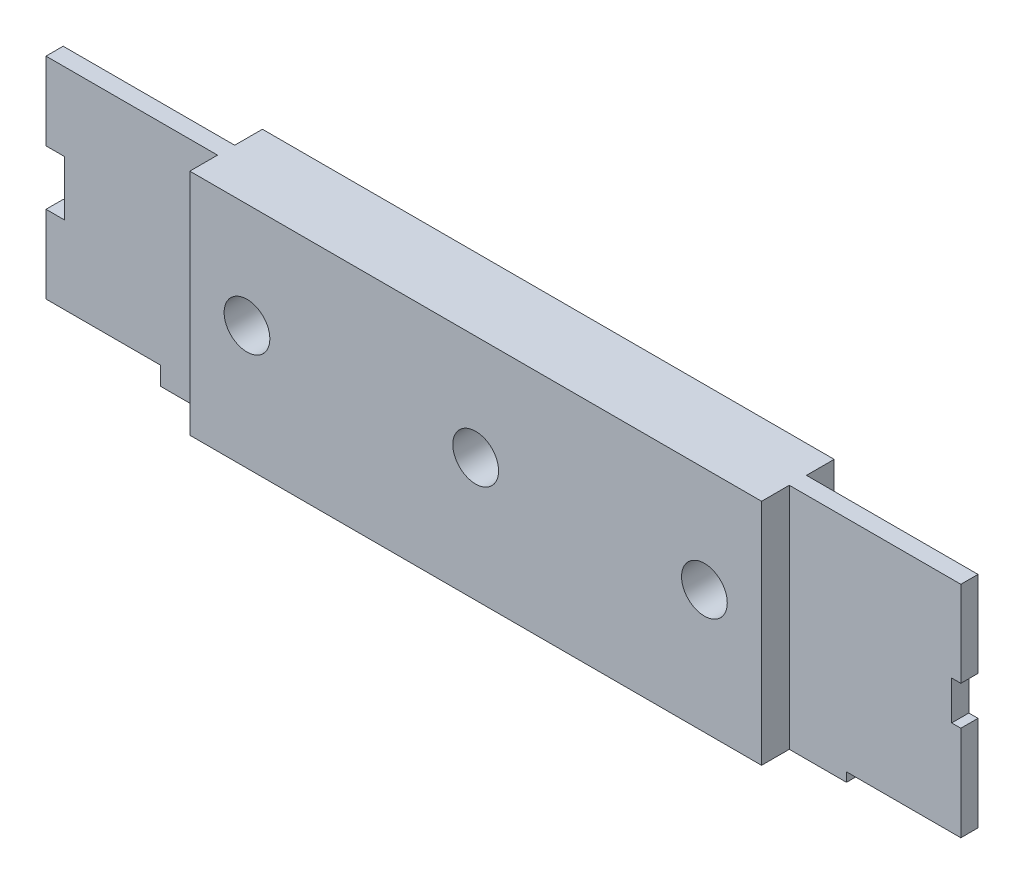
ISO-10303-21;
HEADER;
FILE_DESCRIPTION(('STEP AP214'),'2;1');
FILE_NAME('part.step','',(''),(''),'','','');
FILE_SCHEMA(('AUTOMOTIVE_DESIGN { 1 0 10303 214 1 1 1 1 }'));
ENDSEC;
DATA;
#1=APPLICATION_CONTEXT('core data for automotive mechanical design processes');
#2=APPLICATION_PROTOCOL_DEFINITION('international standard','automotive_design',2000,#1);
#3=PRODUCT_CONTEXT('',#1,'mechanical');
#4=PRODUCT('Part','Part','',(#3));
#5=PRODUCT_RELATED_PRODUCT_CATEGORY('part','',(#4));
#6=PRODUCT_DEFINITION_FORMATION('','',#4);
#7=PRODUCT_DEFINITION_CONTEXT('part definition',#1,'design');
#8=PRODUCT_DEFINITION('design','',#6,#7);
#9=PRODUCT_DEFINITION_SHAPE('','',#8);
#10=(LENGTH_UNIT() NAMED_UNIT(*) SI_UNIT(.MILLI.,.METRE.));
#11=(NAMED_UNIT(*) PLANE_ANGLE_UNIT() SI_UNIT($,.RADIAN.));
#12=(NAMED_UNIT(*) SI_UNIT($,.STERADIAN.) SOLID_ANGLE_UNIT());
#13=UNCERTAINTY_MEASURE_WITH_UNIT(LENGTH_MEASURE(1.E-05),#10,'distance_accuracy_value','');
#14=(GEOMETRIC_REPRESENTATION_CONTEXT(3) GLOBAL_UNCERTAINTY_ASSIGNED_CONTEXT((#13)) GLOBAL_UNIT_ASSIGNED_CONTEXT((#10,
#11,#12)) REPRESENTATION_CONTEXT('',''));
#15=CARTESIAN_POINT('',(0.,0.,0.));
#16=DIRECTION('',(0.,0.,1.));
#17=DIRECTION('',(1.,0.,0.));
#18=AXIS2_PLACEMENT_3D('',#15,#16,#17);
#19=CARTESIAN_POINT('',(0.,0.,0.75));
#20=DIRECTION('',(0.,0.,-1.));
#21=DIRECTION('',(-1.,0.,0.));
#22=AXIS2_PLACEMENT_3D('',#19,#20,#21);
#23=PLANE('',#22);
#24=DIRECTION('',(0.,-1.,0.));
#25=VECTOR('',#24,1.);
#26=CARTESIAN_POINT('',(-25.0000000000001,0.,0.75));
#27=LINE('',#26,#25);
#28=CARTESIAN_POINT('',(-25.0000000000001,9.19999999999999,0.75));
#29=VERTEX_POINT('',#28);
#30=CARTESIAN_POINT('',(-25.0000000000001,-10.8,0.75));
#31=VERTEX_POINT('',#30);
#32=EDGE_CURVE('E218',#29,#31,#27,.T.);
#33=ORIENTED_EDGE('',*,*,#32,.F.);
#34=DIRECTION('',(-1.,0.,0.));
#35=VECTOR('',#34,1.);
#36=CARTESIAN_POINT('',(-40.,9.19999999999997,0.75));
#37=LINE('',#36,#35);
#38=CARTESIAN_POINT('',(-40.,9.19999999999997,0.75));
#39=VERTEX_POINT('',#38);
#40=EDGE_CURVE('E265',#29,#39,#37,.T.);
#41=ORIENTED_EDGE('',*,*,#40,.T.);
#42=DIRECTION('',(0.,-1.,0.));
#43=VECTOR('',#42,1.);
#44=CARTESIAN_POINT('',(-40.,2.4,0.75));
#45=LINE('',#44,#43);
#46=CARTESIAN_POINT('',(-40.,2.4,0.75));
#47=VERTEX_POINT('',#46);
#48=EDGE_CURVE('E233',#39,#47,#45,.T.);
#49=ORIENTED_EDGE('',*,*,#48,.T.);
#50=DIRECTION('',(1.,0.,0.));
#51=VECTOR('',#50,1.);
#52=CARTESIAN_POINT('',(-38.4,2.4,0.75));
#53=LINE('',#52,#51);
#54=CARTESIAN_POINT('',(-38.4,2.4,0.75));
#55=VERTEX_POINT('',#54);
#56=EDGE_CURVE('E236',#47,#55,#53,.T.);
#57=ORIENTED_EDGE('',*,*,#56,.T.);
#58=DIRECTION('',(0.,-1.,0.));
#59=VECTOR('',#58,1.);
#60=CARTESIAN_POINT('',(-38.4,-2.4,0.75));
#61=LINE('',#60,#59);
#62=CARTESIAN_POINT('',(-38.4,-2.4,0.75));
#63=VERTEX_POINT('',#62);
#64=EDGE_CURVE('E239',#55,#63,#61,.T.);
#65=ORIENTED_EDGE('',*,*,#64,.T.);
#66=DIRECTION('',(-1.,0.,0.));
#67=VECTOR('',#66,1.);
#68=CARTESIAN_POINT('',(-40.,-2.4,0.75));
#69=LINE('',#68,#67);
#70=CARTESIAN_POINT('',(-40.,-2.4,0.75));
#71=VERTEX_POINT('',#70);
#72=EDGE_CURVE('E241',#63,#71,#69,.T.);
#73=ORIENTED_EDGE('',*,*,#72,.T.);
#74=DIRECTION('',(0.,-1.,0.));
#75=VECTOR('',#74,1.);
#76=CARTESIAN_POINT('',(-40.,-9.20000000000003,0.75));
#77=LINE('',#76,#75);
#78=CARTESIAN_POINT('',(-40.,-9.20000000000003,0.75));
#79=VERTEX_POINT('',#78);
#80=EDGE_CURVE('E243',#71,#79,#77,.T.);
#81=ORIENTED_EDGE('',*,*,#80,.T.);
#82=DIRECTION('',(1.,0.,0.));
#83=VECTOR('',#82,1.);
#84=CARTESIAN_POINT('',(-30.,-9.2,0.75));
#85=LINE('',#84,#83);
#86=CARTESIAN_POINT('',(-30.,-9.2,0.75));
#87=VERTEX_POINT('',#86);
#88=EDGE_CURVE('E245',#79,#87,#85,.T.);
#89=ORIENTED_EDGE('',*,*,#88,.T.);
#90=DIRECTION('',(0.,-1.,0.));
#91=VECTOR('',#90,1.);
#92=CARTESIAN_POINT('',(-30.,-10.8,0.75));
#93=LINE('',#92,#91);
#94=CARTESIAN_POINT('',(-30.,-10.8,0.75));
#95=VERTEX_POINT('',#94);
#96=EDGE_CURVE('E247',#87,#95,#93,.T.);
#97=ORIENTED_EDGE('',*,*,#96,.T.);
#98=DIRECTION('',(1.,0.,0.));
#99=VECTOR('',#98,1.);
#100=CARTESIAN_POINT('',(30.,-10.7999999999999,0.75));
#101=LINE('',#100,#99);
#102=EDGE_CURVE('E56',#95,#31,#101,.T.);
#103=ORIENTED_EDGE('',*,*,#102,.T.);
#104=EDGE_LOOP('',(#33,#41,#49,#57,#65,#73,#81,#89,#97,#103));
#105=FACE_BOUND('',#104,.T.);
#106=ADVANCED_FACE('F33',(#105),#23,.F.);
#107=DIRECTION('',(0.,1.,0.));
#108=VECTOR('',#107,1.);
#109=CARTESIAN_POINT('',(25.,0.,0.75));
#110=LINE('',#109,#108);
#111=CARTESIAN_POINT('',(25.,-10.7999999999999,0.75));
#112=VERTEX_POINT('',#111);
#113=CARTESIAN_POINT('',(25.,9.19999999999999,0.75));
#114=VERTEX_POINT('',#113);
#115=EDGE_CURVE('E48',#112,#114,#110,.T.);
#116=ORIENTED_EDGE('',*,*,#115,.F.);
#117=CARTESIAN_POINT('',(30.,-10.7999999999999,0.75));
#118=VERTEX_POINT('',#117);
#119=EDGE_CURVE('E249',#112,#118,#101,.T.);
#120=ORIENTED_EDGE('',*,*,#119,.T.);
#121=DIRECTION('',(0.,1.,0.));
#122=VECTOR('',#121,1.);
#123=CARTESIAN_POINT('',(30.,-9.99999999999986,0.75));
#124=LINE('',#123,#122);
#125=CARTESIAN_POINT('',(30.,-9.99999999999986,0.75));
#126=VERTEX_POINT('',#125);
#127=EDGE_CURVE('E251',#118,#126,#124,.T.);
#128=ORIENTED_EDGE('',*,*,#127,.T.);
#129=DIRECTION('',(1.,0.,0.));
#130=VECTOR('',#129,1.);
#131=CARTESIAN_POINT('',(40.,-9.99999999999984,0.75));
#132=LINE('',#131,#130);
#133=CARTESIAN_POINT('',(40.,-9.99999999999984,0.75));
#134=VERTEX_POINT('',#133);
#135=EDGE_CURVE('E253',#126,#134,#132,.T.);
#136=ORIENTED_EDGE('',*,*,#135,.T.);
#137=DIRECTION('',(0.,1.,0.));
#138=VECTOR('',#137,1.);
#139=CARTESIAN_POINT('',(40.,-1.7,0.75));
#140=LINE('',#139,#138);
#141=CARTESIAN_POINT('',(40.,-1.7,0.75));
#142=VERTEX_POINT('',#141);
#143=EDGE_CURVE('E255',#134,#142,#140,.T.);
#144=ORIENTED_EDGE('',*,*,#143,.T.);
#145=DIRECTION('',(-1.,0.,0.));
#146=VECTOR('',#145,1.);
#147=CARTESIAN_POINT('',(39.2,-1.7,0.75));
#148=LINE('',#147,#146);
#149=CARTESIAN_POINT('',(39.2,-1.7,0.75));
#150=VERTEX_POINT('',#149);
#151=EDGE_CURVE('E257',#142,#150,#148,.T.);
#152=ORIENTED_EDGE('',*,*,#151,.T.);
#153=DIRECTION('',(0.,1.,0.));
#154=VECTOR('',#153,1.);
#155=CARTESIAN_POINT('',(39.2,1.7,0.75));
#156=LINE('',#155,#154);
#157=CARTESIAN_POINT('',(39.2,1.7,0.75));
#158=VERTEX_POINT('',#157);
#159=EDGE_CURVE('E259',#150,#158,#156,.T.);
#160=ORIENTED_EDGE('',*,*,#159,.T.);
#161=DIRECTION('',(1.,0.,0.));
#162=VECTOR('',#161,1.);
#163=CARTESIAN_POINT('',(40.,1.7,0.75));
#164=LINE('',#163,#162);
#165=CARTESIAN_POINT('',(40.,1.7,0.75));
#166=VERTEX_POINT('',#165);
#167=EDGE_CURVE('E261',#158,#166,#164,.T.);
#168=ORIENTED_EDGE('',*,*,#167,.T.);
#169=DIRECTION('',(0.,1.,0.));
#170=VECTOR('',#169,1.);
#171=CARTESIAN_POINT('',(40.,9.19999999999999,0.75));
#172=LINE('',#171,#170);
#173=CARTESIAN_POINT('',(40.,9.19999999999999,0.75));
#174=VERTEX_POINT('',#173);
#175=EDGE_CURVE('E263',#166,#174,#172,.T.);
#176=ORIENTED_EDGE('',*,*,#175,.T.);
#177=EDGE_CURVE('E266',#174,#114,#37,.T.);
#178=ORIENTED_EDGE('',*,*,#177,.T.);
#179=EDGE_LOOP('',(#116,#120,#128,#136,#144,#152,#160,#168,#176,#178));
#180=FACE_BOUND('',#179,.T.);
#181=ADVANCED_FACE('F429',(#180),#23,.F.);
#182=CARTESIAN_POINT('',(0.,0.,-0.75));
#183=DIRECTION('',(0.,0.,-1.));
#184=DIRECTION('',(-1.,0.,0.));
#185=AXIS2_PLACEMENT_3D('',#182,#183,#184);
#186=PLANE('',#185);
#187=DIRECTION('',(-1.,0.,0.));
#188=VECTOR('',#187,1.);
#189=CARTESIAN_POINT('',(-40.,9.19999999999997,-0.75));
#190=LINE('',#189,#188);
#191=CARTESIAN_POINT('',(-25.0000000000001,9.19999999999998,-0.75));
#192=VERTEX_POINT('',#191);
#193=CARTESIAN_POINT('',(-40.,9.19999999999997,-0.75));
#194=VERTEX_POINT('',#193);
#195=EDGE_CURVE('E301',#192,#194,#190,.T.);
#196=ORIENTED_EDGE('',*,*,#195,.F.);
#197=DIRECTION('',(0.,-1.,0.));
#198=VECTOR('',#197,1.);
#199=CARTESIAN_POINT('',(-25.0000000000001,0.,-0.75));
#200=LINE('',#199,#198);
#201=CARTESIAN_POINT('',(-25.,-10.8,-0.75));
#202=VERTEX_POINT('',#201);
#203=EDGE_CURVE('E228',#192,#202,#200,.T.);
#204=ORIENTED_EDGE('',*,*,#203,.T.);
#205=DIRECTION('',(1.,0.,0.));
#206=VECTOR('',#205,1.);
#207=CARTESIAN_POINT('',(30.,-10.7999999999999,-0.75));
#208=LINE('',#207,#206);
#209=CARTESIAN_POINT('',(-30.,-10.8,-0.75));
#210=VERTEX_POINT('',#209);
#211=EDGE_CURVE('E284',#210,#202,#208,.T.);
#212=ORIENTED_EDGE('',*,*,#211,.F.);
#213=DIRECTION('',(0.,-1.,0.));
#214=VECTOR('',#213,1.);
#215=CARTESIAN_POINT('',(-30.,-10.8,-0.75));
#216=LINE('',#215,#214);
#217=CARTESIAN_POINT('',(-30.,-9.2,-0.75));
#218=VERTEX_POINT('',#217);
#219=EDGE_CURVE('E281',#218,#210,#216,.T.);
#220=ORIENTED_EDGE('',*,*,#219,.F.);
#221=DIRECTION('',(1.,0.,0.));
#222=VECTOR('',#221,1.);
#223=CARTESIAN_POINT('',(-30.,-9.2,-0.75));
#224=LINE('',#223,#222);
#225=CARTESIAN_POINT('',(-40.,-9.20000000000003,-0.75));
#226=VERTEX_POINT('',#225);
#227=EDGE_CURVE('E279',#226,#218,#224,.T.);
#228=ORIENTED_EDGE('',*,*,#227,.F.);
#229=DIRECTION('',(0.,-1.,0.));
#230=VECTOR('',#229,1.);
#231=CARTESIAN_POINT('',(-40.,-9.20000000000003,-0.75));
#232=LINE('',#231,#230);
#233=CARTESIAN_POINT('',(-40.,-2.4,-0.75));
#234=VERTEX_POINT('',#233);
#235=EDGE_CURVE('E277',#234,#226,#232,.T.);
#236=ORIENTED_EDGE('',*,*,#235,.F.);
#237=DIRECTION('',(-1.,0.,0.));
#238=VECTOR('',#237,1.);
#239=CARTESIAN_POINT('',(-40.,-2.4,-0.75));
#240=LINE('',#239,#238);
#241=CARTESIAN_POINT('',(-38.4,-2.4,-0.75));
#242=VERTEX_POINT('',#241);
#243=EDGE_CURVE('E275',#242,#234,#240,.T.);
#244=ORIENTED_EDGE('',*,*,#243,.F.);
#245=DIRECTION('',(0.,-1.,0.));
#246=VECTOR('',#245,1.);
#247=CARTESIAN_POINT('',(-38.4,-2.4,-0.75));
#248=LINE('',#247,#246);
#249=CARTESIAN_POINT('',(-38.4,2.4,-0.75));
#250=VERTEX_POINT('',#249);
#251=EDGE_CURVE('E273',#250,#242,#248,.T.);
#252=ORIENTED_EDGE('',*,*,#251,.F.);
#253=DIRECTION('',(1.,0.,0.));
#254=VECTOR('',#253,1.);
#255=CARTESIAN_POINT('',(-38.4,2.4,-0.75));
#256=LINE('',#255,#254);
#257=CARTESIAN_POINT('',(-40.,2.4,-0.75));
#258=VERTEX_POINT('',#257);
#259=EDGE_CURVE('E271',#258,#250,#256,.T.);
#260=ORIENTED_EDGE('',*,*,#259,.F.);
#261=DIRECTION('',(0.,-1.,0.));
#262=VECTOR('',#261,1.);
#263=CARTESIAN_POINT('',(-40.,2.4,-0.75));
#264=LINE('',#263,#262);
#265=EDGE_CURVE('E232',#194,#258,#264,.T.);
#266=ORIENTED_EDGE('',*,*,#265,.F.);
#267=EDGE_LOOP('',(#196,#204,#212,#220,#228,#236,#244,#252,#260,#266));
#268=FACE_BOUND('',#267,.T.);
#269=ADVANCED_FACE('F355',(#268),#186,.T.);
#270=CARTESIAN_POINT('',(25.,-10.8,-0.75));
#271=VERTEX_POINT('',#270);
#272=CARTESIAN_POINT('',(30.,-10.7999999999999,-0.75));
#273=VERTEX_POINT('',#272);
#274=EDGE_CURVE('E283',#271,#273,#208,.T.);
#275=ORIENTED_EDGE('',*,*,#274,.F.);
#276=DIRECTION('',(0.,1.,0.));
#277=VECTOR('',#276,1.);
#278=CARTESIAN_POINT('',(25.,0.,-0.75));
#279=LINE('',#278,#277);
#280=CARTESIAN_POINT('',(25.,9.19999999999999,-0.75));
#281=VERTEX_POINT('',#280);
#282=EDGE_CURVE('E219',#271,#281,#279,.T.);
#283=ORIENTED_EDGE('',*,*,#282,.T.);
#284=CARTESIAN_POINT('',(40.,9.19999999999999,-0.75));
#285=VERTEX_POINT('',#284);
#286=EDGE_CURVE('E237',#285,#281,#190,.T.);
#287=ORIENTED_EDGE('',*,*,#286,.F.);
#288=DIRECTION('',(0.,1.,0.));
#289=VECTOR('',#288,1.);
#290=CARTESIAN_POINT('',(40.,9.19999999999999,-0.75));
#291=LINE('',#290,#289);
#292=CARTESIAN_POINT('',(40.,1.7,-0.75));
#293=VERTEX_POINT('',#292);
#294=EDGE_CURVE('E299',#293,#285,#291,.T.);
#295=ORIENTED_EDGE('',*,*,#294,.F.);
#296=DIRECTION('',(1.,0.,0.));
#297=VECTOR('',#296,1.);
#298=CARTESIAN_POINT('',(40.,1.7,-0.75));
#299=LINE('',#298,#297);
#300=CARTESIAN_POINT('',(39.2,1.7,-0.75));
#301=VERTEX_POINT('',#300);
#302=EDGE_CURVE('E297',#301,#293,#299,.T.);
#303=ORIENTED_EDGE('',*,*,#302,.F.);
#304=DIRECTION('',(0.,1.,0.));
#305=VECTOR('',#304,1.);
#306=CARTESIAN_POINT('',(39.2,1.7,-0.75));
#307=LINE('',#306,#305);
#308=CARTESIAN_POINT('',(39.2,-1.7,-0.75));
#309=VERTEX_POINT('',#308);
#310=EDGE_CURVE('E295',#309,#301,#307,.T.);
#311=ORIENTED_EDGE('',*,*,#310,.F.);
#312=DIRECTION('',(-1.,0.,0.));
#313=VECTOR('',#312,1.);
#314=CARTESIAN_POINT('',(39.2,-1.7,-0.75));
#315=LINE('',#314,#313);
#316=CARTESIAN_POINT('',(40.,-1.7,-0.75));
#317=VERTEX_POINT('',#316);
#318=EDGE_CURVE('E293',#317,#309,#315,.T.);
#319=ORIENTED_EDGE('',*,*,#318,.F.);
#320=DIRECTION('',(0.,1.,0.));
#321=VECTOR('',#320,1.);
#322=CARTESIAN_POINT('',(40.,-1.7,-0.75));
#323=LINE('',#322,#321);
#324=CARTESIAN_POINT('',(40.,-9.99999999999984,-0.75));
#325=VERTEX_POINT('',#324);
#326=EDGE_CURVE('E291',#325,#317,#323,.T.);
#327=ORIENTED_EDGE('',*,*,#326,.F.);
#328=DIRECTION('',(1.,0.,0.));
#329=VECTOR('',#328,1.);
#330=CARTESIAN_POINT('',(40.,-9.99999999999984,-0.75));
#331=LINE('',#330,#329);
#332=CARTESIAN_POINT('',(30.,-9.99999999999986,-0.75));
#333=VERTEX_POINT('',#332);
#334=EDGE_CURVE('E289',#333,#325,#331,.T.);
#335=ORIENTED_EDGE('',*,*,#334,.F.);
#336=DIRECTION('',(0.,1.,0.));
#337=VECTOR('',#336,1.);
#338=CARTESIAN_POINT('',(30.,-9.99999999999986,-0.75));
#339=LINE('',#338,#337);
#340=EDGE_CURVE('E287',#273,#333,#339,.T.);
#341=ORIENTED_EDGE('',*,*,#340,.F.);
#342=EDGE_LOOP('',(#275,#283,#287,#295,#303,#311,#319,#327,#335,#341));
#343=FACE_BOUND('',#342,.T.);
#344=ADVANCED_FACE('F417',(#343),#186,.T.);
#345=CARTESIAN_POINT('',(-40.,2.4,0.75));
#346=DIRECTION('',(1.,0.,0.));
#347=DIRECTION('',(0.,1.,0.));
#348=AXIS2_PLACEMENT_3D('',#345,#346,#347);
#349=PLANE('',#348);
#350=ORIENTED_EDGE('',*,*,#265,.T.);
#351=DIRECTION('',(0.,0.,-1.));
#352=VECTOR('',#351,1.);
#353=CARTESIAN_POINT('',(-40.,2.4,0.75));
#354=LINE('',#353,#352);
#355=EDGE_CURVE('E11',#47,#258,#354,.T.);
#356=ORIENTED_EDGE('',*,*,#355,.F.);
#357=ORIENTED_EDGE('',*,*,#48,.F.);
#358=DIRECTION('',(0.,0.,-1.));
#359=VECTOR('',#358,1.);
#360=CARTESIAN_POINT('',(-40.,9.19999999999997,0.75));
#361=LINE('',#360,#359);
#362=EDGE_CURVE('E268',#39,#194,#361,.T.);
#363=ORIENTED_EDGE('',*,*,#362,.T.);
#364=EDGE_LOOP('',(#350,#356,#357,#363));
#365=FACE_BOUND('',#364,.T.);
#366=ADVANCED_FACE('F35',(#365),#349,.F.);
#367=CARTESIAN_POINT('',(-38.4,2.4,0.75));
#368=DIRECTION('',(0.,1.,0.));
#369=DIRECTION('',(0.,0.,1.));
#370=AXIS2_PLACEMENT_3D('',#367,#368,#369);
#371=PLANE('',#370);
#372=ORIENTED_EDGE('',*,*,#259,.T.);
#373=DIRECTION('',(0.,0.,-1.));
#374=VECTOR('',#373,1.);
#375=CARTESIAN_POINT('',(-38.4,2.4,0.75));
#376=LINE('',#375,#374);
#377=EDGE_CURVE('E41',#55,#250,#376,.T.);
#378=ORIENTED_EDGE('',*,*,#377,.F.);
#379=ORIENTED_EDGE('',*,*,#56,.F.);
#380=ORIENTED_EDGE('',*,*,#355,.T.);
#381=EDGE_LOOP('',(#372,#378,#379,#380));
#382=FACE_BOUND('',#381,.T.);
#383=ADVANCED_FACE('F371',(#382),#371,.F.);
#384=CARTESIAN_POINT('',(-38.4,-2.4,0.75));
#385=DIRECTION('',(1.,0.,0.));
#386=DIRECTION('',(0.,0.,-1.));
#387=AXIS2_PLACEMENT_3D('',#384,#385,#386);
#388=PLANE('',#387);
#389=ORIENTED_EDGE('',*,*,#251,.T.);
#390=DIRECTION('',(0.,0.,-1.));
#391=VECTOR('',#390,1.);
#392=CARTESIAN_POINT('',(-38.4,-2.4,0.75));
#393=LINE('',#392,#391);
#394=EDGE_CURVE('E342',#63,#242,#393,.T.);
#395=ORIENTED_EDGE('',*,*,#394,.F.);
#396=ORIENTED_EDGE('',*,*,#64,.F.);
#397=ORIENTED_EDGE('',*,*,#377,.T.);
#398=EDGE_LOOP('',(#389,#395,#396,#397));
#399=FACE_BOUND('',#398,.T.);
#400=ADVANCED_FACE('F349',(#399),#388,.F.);
#401=CARTESIAN_POINT('',(-40.,-2.4,0.75));
#402=DIRECTION('',(0.,-1.,0.));
#403=DIRECTION('',(0.,0.,-1.));
#404=AXIS2_PLACEMENT_3D('',#401,#402,#403);
#405=PLANE('',#404);
#406=ORIENTED_EDGE('',*,*,#243,.T.);
#407=DIRECTION('',(0.,0.,-1.));
#408=VECTOR('',#407,1.);
#409=CARTESIAN_POINT('',(-40.,-2.4,0.75));
#410=LINE('',#409,#408);
#411=EDGE_CURVE('E339',#71,#234,#410,.T.);
#412=ORIENTED_EDGE('',*,*,#411,.F.);
#413=ORIENTED_EDGE('',*,*,#72,.F.);
#414=ORIENTED_EDGE('',*,*,#394,.T.);
#415=EDGE_LOOP('',(#406,#412,#413,#414));
#416=FACE_BOUND('',#415,.T.);
#417=ADVANCED_FACE('F361',(#416),#405,.F.);
#418=CARTESIAN_POINT('',(-40.,-9.20000000000003,0.75));
#419=DIRECTION('',(1.,0.,0.));
#420=DIRECTION('',(0.,1.,0.));
#421=AXIS2_PLACEMENT_3D('',#418,#419,#420);
#422=PLANE('',#421);
#423=ORIENTED_EDGE('',*,*,#235,.T.);
#424=DIRECTION('',(0.,0.,-1.));
#425=VECTOR('',#424,1.);
#426=CARTESIAN_POINT('',(-40.,-9.20000000000003,0.75));
#427=LINE('',#426,#425);
#428=EDGE_CURVE('E336',#79,#226,#427,.T.);
#429=ORIENTED_EDGE('',*,*,#428,.F.);
#430=ORIENTED_EDGE('',*,*,#80,.F.);
#431=ORIENTED_EDGE('',*,*,#411,.T.);
#432=EDGE_LOOP('',(#423,#429,#430,#431));
#433=FACE_BOUND('',#432,.T.);
#434=ADVANCED_FACE('F365',(#433),#422,.F.);
#435=CARTESIAN_POINT('',(-30.,-9.2,0.75));
#436=DIRECTION('',(0.,1.,0.));
#437=DIRECTION('',(-1.,0.,0.));
#438=AXIS2_PLACEMENT_3D('',#435,#436,#437);
#439=PLANE('',#438);
#440=ORIENTED_EDGE('',*,*,#227,.T.);
#441=DIRECTION('',(0.,0.,-1.));
#442=VECTOR('',#441,1.);
#443=CARTESIAN_POINT('',(-30.,-9.2,0.75));
#444=LINE('',#443,#442);
#445=EDGE_CURVE('E333',#87,#218,#444,.T.);
#446=ORIENTED_EDGE('',*,*,#445,.F.);
#447=ORIENTED_EDGE('',*,*,#88,.F.);
#448=ORIENTED_EDGE('',*,*,#428,.T.);
#449=EDGE_LOOP('',(#440,#446,#447,#448));
#450=FACE_BOUND('',#449,.T.);
#451=ADVANCED_FACE('F505',(#450),#439,.F.);
#452=CARTESIAN_POINT('',(-30.,-10.8,0.75));
#453=DIRECTION('',(1.,0.,0.));
#454=DIRECTION('',(0.,1.,0.));
#455=AXIS2_PLACEMENT_3D('',#452,#453,#454);
#456=PLANE('',#455);
#457=ORIENTED_EDGE('',*,*,#219,.T.);
#458=DIRECTION('',(0.,0.,-1.));
#459=VECTOR('',#458,1.);
#460=CARTESIAN_POINT('',(-30.,-10.8,0.75));
#461=LINE('',#460,#459);
#462=EDGE_CURVE('E330',#95,#210,#461,.T.);
#463=ORIENTED_EDGE('',*,*,#462,.F.);
#464=ORIENTED_EDGE('',*,*,#96,.F.);
#465=ORIENTED_EDGE('',*,*,#445,.T.);
#466=EDGE_LOOP('',(#457,#463,#464,#465));
#467=FACE_BOUND('',#466,.T.);
#468=ADVANCED_FACE('F502',(#467),#456,.F.);
#469=CARTESIAN_POINT('',(30.,-10.7999999999999,0.75));
#470=DIRECTION('',(0.,1.,0.));
#471=DIRECTION('',(-1.,0.,0.));
#472=AXIS2_PLACEMENT_3D('',#469,#470,#471);
#473=PLANE('',#472);
#474=ORIENTED_EDGE('',*,*,#119,.F.);
#475=DIRECTION('',(0.,0.,-1.));
#476=VECTOR('',#475,1.);
#477=CARTESIAN_POINT('',(25.,-10.8,3.175));
#478=LINE('',#477,#476);
#479=CARTESIAN_POINT('',(25.,-10.8,3.175));
#480=VERTEX_POINT('',#479);
#481=EDGE_CURVE('E201',#480,#112,#478,.T.);
#482=ORIENTED_EDGE('',*,*,#481,.F.);
#483=DIRECTION('',(1.,0.,0.));
#484=VECTOR('',#483,1.);
#485=CARTESIAN_POINT('',(-25.,-10.8,3.175));
#486=LINE('',#485,#484);
#487=CARTESIAN_POINT('',(-25.,-10.8,3.175));
#488=VERTEX_POINT('',#487);
#489=EDGE_CURVE('E195',#488,#480,#486,.T.);
#490=ORIENTED_EDGE('',*,*,#489,.F.);
#491=DIRECTION('',(0.,0.,-1.));
#492=VECTOR('',#491,1.);
#493=CARTESIAN_POINT('',(-25.,-10.8,3.175));
#494=LINE('',#493,#492);
#495=EDGE_CURVE('E199',#488,#31,#494,.T.);
#496=ORIENTED_EDGE('',*,*,#495,.T.);
#497=ORIENTED_EDGE('',*,*,#102,.F.);
#498=ORIENTED_EDGE('',*,*,#462,.T.);
#499=ORIENTED_EDGE('',*,*,#211,.T.);
#500=CARTESIAN_POINT('',(-25.,-10.8,-3.175));
#501=VERTEX_POINT('',#500);
#502=EDGE_CURVE('E220',#202,#501,#494,.T.);
#503=ORIENTED_EDGE('',*,*,#502,.T.);
#504=DIRECTION('',(1.,0.,0.));
#505=VECTOR('',#504,1.);
#506=CARTESIAN_POINT('',(-25.,-10.8,-3.175));
#507=LINE('',#506,#505);
#508=CARTESIAN_POINT('',(25.,-10.8,-3.175));
#509=VERTEX_POINT('',#508);
#510=EDGE_CURVE('E391',#501,#509,#507,.T.);
#511=ORIENTED_EDGE('',*,*,#510,.T.);
#512=EDGE_CURVE('E407',#271,#509,#478,.T.);
#513=ORIENTED_EDGE('',*,*,#512,.F.);
#514=ORIENTED_EDGE('',*,*,#274,.T.);
#515=DIRECTION('',(0.,0.,-1.));
#516=VECTOR('',#515,1.);
#517=CARTESIAN_POINT('',(30.,-10.7999999999999,0.75));
#518=LINE('',#517,#516);
#519=EDGE_CURVE('E327',#118,#273,#518,.T.);
#520=ORIENTED_EDGE('',*,*,#519,.F.);
#521=EDGE_LOOP('',(#474,#482,#490,#496,#497,#498,#499,#503,#511,#513,#514,#520));
#522=FACE_BOUND('',#521,.T.);
#523=ADVANCED_FACE('F197',(#522),#473,.F.);
#524=CARTESIAN_POINT('',(30.,-9.99999999999986,0.75));
#525=DIRECTION('',(-1.,0.,0.));
#526=DIRECTION('',(0.,-1.,0.));
#527=AXIS2_PLACEMENT_3D('',#524,#525,#526);
#528=PLANE('',#527);
#529=ORIENTED_EDGE('',*,*,#340,.T.);
#530=DIRECTION('',(0.,0.,-1.));
#531=VECTOR('',#530,1.);
#532=CARTESIAN_POINT('',(30.,-9.99999999999986,0.75));
#533=LINE('',#532,#531);
#534=EDGE_CURVE('E324',#126,#333,#533,.T.);
#535=ORIENTED_EDGE('',*,*,#534,.F.);
#536=ORIENTED_EDGE('',*,*,#127,.F.);
#537=ORIENTED_EDGE('',*,*,#519,.T.);
#538=EDGE_LOOP('',(#529,#535,#536,#537));
#539=FACE_BOUND('',#538,.T.);
#540=ADVANCED_FACE('F422',(#539),#528,.F.);
#541=CARTESIAN_POINT('',(40.,-9.99999999999984,0.75));
#542=DIRECTION('',(0.,1.,0.));
#543=DIRECTION('',(-1.,0.,0.));
#544=AXIS2_PLACEMENT_3D('',#541,#542,#543);
#545=PLANE('',#544);
#546=ORIENTED_EDGE('',*,*,#334,.T.);
#547=DIRECTION('',(0.,0.,-1.));
#548=VECTOR('',#547,1.);
#549=CARTESIAN_POINT('',(40.,-9.99999999999984,0.75));
#550=LINE('',#549,#548);
#551=EDGE_CURVE('E321',#134,#325,#550,.T.);
#552=ORIENTED_EDGE('',*,*,#551,.F.);
#553=ORIENTED_EDGE('',*,*,#135,.F.);
#554=ORIENTED_EDGE('',*,*,#534,.T.);
#555=EDGE_LOOP('',(#546,#552,#553,#554));
#556=FACE_BOUND('',#555,.T.);
#557=ADVANCED_FACE('F426',(#556),#545,.F.);
#558=CARTESIAN_POINT('',(40.,-1.7,0.75));
#559=DIRECTION('',(-1.,0.,0.));
#560=DIRECTION('',(0.,-1.,0.));
#561=AXIS2_PLACEMENT_3D('',#558,#559,#560);
#562=PLANE('',#561);
#563=ORIENTED_EDGE('',*,*,#326,.T.);
#564=DIRECTION('',(0.,0.,-1.));
#565=VECTOR('',#564,1.);
#566=CARTESIAN_POINT('',(40.,-1.7,0.75));
#567=LINE('',#566,#565);
#568=EDGE_CURVE('E318',#142,#317,#567,.T.);
#569=ORIENTED_EDGE('',*,*,#568,.F.);
#570=ORIENTED_EDGE('',*,*,#143,.F.);
#571=ORIENTED_EDGE('',*,*,#551,.T.);
#572=EDGE_LOOP('',(#563,#569,#570,#571));
#573=FACE_BOUND('',#572,.T.);
#574=ADVANCED_FACE('F491',(#573),#562,.F.);
#575=CARTESIAN_POINT('',(39.2,-1.7,0.75));
#576=DIRECTION('',(0.,-1.,0.));
#577=DIRECTION('',(1.,0.,0.));
#578=AXIS2_PLACEMENT_3D('',#575,#576,#577);
#579=PLANE('',#578);
#580=ORIENTED_EDGE('',*,*,#318,.T.);
#581=DIRECTION('',(0.,0.,-1.));
#582=VECTOR('',#581,1.);
#583=CARTESIAN_POINT('',(39.2,-1.7,0.75));
#584=LINE('',#583,#582);
#585=EDGE_CURVE('E315',#150,#309,#584,.T.);
#586=ORIENTED_EDGE('',*,*,#585,.F.);
#587=ORIENTED_EDGE('',*,*,#151,.F.);
#588=ORIENTED_EDGE('',*,*,#568,.T.);
#589=EDGE_LOOP('',(#580,#586,#587,#588));
#590=FACE_BOUND('',#589,.T.);
#591=ADVANCED_FACE('F487',(#590),#579,.F.);
#592=CARTESIAN_POINT('',(39.2,1.7,0.75));
#593=DIRECTION('',(-1.,0.,0.));
#594=DIRECTION('',(0.,0.,1.));
#595=AXIS2_PLACEMENT_3D('',#592,#593,#594);
#596=PLANE('',#595);
#597=ORIENTED_EDGE('',*,*,#310,.T.);
#598=DIRECTION('',(0.,0.,-1.));
#599=VECTOR('',#598,1.);
#600=CARTESIAN_POINT('',(39.2,1.7,0.75));
#601=LINE('',#600,#599);
#602=EDGE_CURVE('E312',#158,#301,#601,.T.);
#603=ORIENTED_EDGE('',*,*,#602,.F.);
#604=ORIENTED_EDGE('',*,*,#159,.F.);
#605=ORIENTED_EDGE('',*,*,#585,.T.);
#606=EDGE_LOOP('',(#597,#603,#604,#605));
#607=FACE_BOUND('',#606,.T.);
#608=ADVANCED_FACE('F483',(#607),#596,.F.);
#609=CARTESIAN_POINT('',(40.,1.7,0.75));
#610=DIRECTION('',(0.,1.,0.));
#611=DIRECTION('',(-1.,0.,0.));
#612=AXIS2_PLACEMENT_3D('',#609,#610,#611);
#613=PLANE('',#612);
#614=ORIENTED_EDGE('',*,*,#302,.T.);
#615=DIRECTION('',(0.,0.,-1.));
#616=VECTOR('',#615,1.);
#617=CARTESIAN_POINT('',(40.,1.7,0.75));
#618=LINE('',#617,#616);
#619=EDGE_CURVE('E309',#166,#293,#618,.T.);
#620=ORIENTED_EDGE('',*,*,#619,.F.);
#621=ORIENTED_EDGE('',*,*,#167,.F.);
#622=ORIENTED_EDGE('',*,*,#602,.T.);
#623=EDGE_LOOP('',(#614,#620,#621,#622));
#624=FACE_BOUND('',#623,.T.);
#625=ADVANCED_FACE('F479',(#624),#613,.F.);
#626=CARTESIAN_POINT('',(40.,9.19999999999999,0.75));
#627=DIRECTION('',(-1.,0.,0.));
#628=DIRECTION('',(0.,0.,1.));
#629=AXIS2_PLACEMENT_3D('',#626,#627,#628);
#630=PLANE('',#629);
#631=ORIENTED_EDGE('',*,*,#294,.T.);
#632=DIRECTION('',(0.,0.,-1.));
#633=VECTOR('',#632,1.);
#634=CARTESIAN_POINT('',(40.,9.19999999999999,0.75));
#635=LINE('',#634,#633);
#636=EDGE_CURVE('E306',#174,#285,#635,.T.);
#637=ORIENTED_EDGE('',*,*,#636,.F.);
#638=ORIENTED_EDGE('',*,*,#175,.F.);
#639=ORIENTED_EDGE('',*,*,#619,.T.);
#640=EDGE_LOOP('',(#631,#637,#638,#639));
#641=FACE_BOUND('',#640,.T.);
#642=ADVANCED_FACE('F476',(#641),#630,.F.);
#643=CARTESIAN_POINT('',(-40.,9.19999999999997,0.75));
#644=DIRECTION('',(0.,-1.,0.));
#645=DIRECTION('',(1.,0.,0.));
#646=AXIS2_PLACEMENT_3D('',#643,#644,#645);
#647=PLANE('',#646);
#648=ORIENTED_EDGE('',*,*,#286,.T.);
#649=DIRECTION('',(0.,0.,-1.));
#650=VECTOR('',#649,1.);
#651=CARTESIAN_POINT('',(25.,9.19999999999999,3.175));
#652=LINE('',#651,#650);
#653=CARTESIAN_POINT('',(25.,9.19999999999999,-3.175));
#654=VERTEX_POINT('',#653);
#655=EDGE_CURVE('E404',#281,#654,#652,.T.);
#656=ORIENTED_EDGE('',*,*,#655,.T.);
#657=DIRECTION('',(-1.,0.,0.));
#658=VECTOR('',#657,1.);
#659=CARTESIAN_POINT('',(-25.0000000000001,9.19999999999999,-3.175));
#660=LINE('',#659,#658);
#661=CARTESIAN_POINT('',(-25.0000000000001,9.19999999999999,-3.175));
#662=VERTEX_POINT('',#661);
#663=EDGE_CURVE('E215',#654,#662,#660,.T.);
#664=ORIENTED_EDGE('',*,*,#663,.T.);
#665=DIRECTION('',(0.,0.,-1.));
#666=VECTOR('',#665,1.);
#667=CARTESIAN_POINT('',(-25.0000000000001,9.19999999999999,3.175));
#668=LINE('',#667,#666);
#669=EDGE_CURVE('E379',#192,#662,#668,.T.);
#670=ORIENTED_EDGE('',*,*,#669,.F.);
#671=ORIENTED_EDGE('',*,*,#195,.T.);
#672=ORIENTED_EDGE('',*,*,#362,.F.);
#673=ORIENTED_EDGE('',*,*,#40,.F.);
#674=CARTESIAN_POINT('',(-25.0000000000001,9.19999999999999,3.175));
#675=VERTEX_POINT('',#674);
#676=EDGE_CURVE('E384',#675,#29,#668,.T.);
#677=ORIENTED_EDGE('',*,*,#676,.F.);
#678=DIRECTION('',(-1.,0.,0.));
#679=VECTOR('',#678,1.);
#680=CARTESIAN_POINT('',(-25.0000000000001,9.19999999999999,3.175));
#681=LINE('',#680,#679);
#682=CARTESIAN_POINT('',(25.,9.19999999999999,3.175));
#683=VERTEX_POINT('',#682);
#684=EDGE_CURVE('E211',#683,#675,#681,.T.);
#685=ORIENTED_EDGE('',*,*,#684,.F.);
#686=EDGE_CURVE('E405',#683,#114,#652,.T.);
#687=ORIENTED_EDGE('',*,*,#686,.T.);
#688=ORIENTED_EDGE('',*,*,#177,.F.);
#689=ORIENTED_EDGE('',*,*,#636,.T.);
#690=EDGE_LOOP('',(#648,#656,#664,#670,#671,#672,#673,#677,#685,#687,#688,#689));
#691=FACE_BOUND('',#690,.T.);
#692=ADVANCED_FACE('F377',(#691),#647,.F.);
#693=CARTESIAN_POINT('',(25.,9.19999999999999,3.175));
#694=DIRECTION('',(-1.,0.,0.));
#695=DIRECTION('',(0.,-1.,0.));
#696=AXIS2_PLACEMENT_3D('',#693,#694,#695);
#697=PLANE('',#696);
#698=ORIENTED_EDGE('',*,*,#282,.F.);
#699=ORIENTED_EDGE('',*,*,#512,.T.);
#700=DIRECTION('',(0.,1.,0.));
#701=VECTOR('',#700,1.);
#702=CARTESIAN_POINT('',(25.,9.19999999999999,-3.175));
#703=LINE('',#702,#701);
#704=EDGE_CURVE('E397',#509,#654,#703,.T.);
#705=ORIENTED_EDGE('',*,*,#704,.T.);
#706=ORIENTED_EDGE('',*,*,#655,.F.);
#707=EDGE_LOOP('',(#698,#699,#705,#706));
#708=FACE_BOUND('',#707,.T.);
#709=ADVANCED_FACE('F412',(#708),#697,.F.);
#710=CARTESIAN_POINT('',(-25.0000000000001,9.19999999999999,3.175));
#711=DIRECTION('',(1.,0.,0.));
#712=DIRECTION('',(0.,1.,0.));
#713=AXIS2_PLACEMENT_3D('',#710,#711,#712);
#714=PLANE('',#713);
#715=ORIENTED_EDGE('',*,*,#203,.F.);
#716=ORIENTED_EDGE('',*,*,#669,.T.);
#717=DIRECTION('',(0.,-1.,0.));
#718=VECTOR('',#717,1.);
#719=CARTESIAN_POINT('',(-25.0000000000001,9.19999999999999,-3.175));
#720=LINE('',#719,#718);
#721=EDGE_CURVE('E387',#662,#501,#720,.T.);
#722=ORIENTED_EDGE('',*,*,#721,.T.);
#723=ORIENTED_EDGE('',*,*,#502,.F.);
#724=EDGE_LOOP('',(#715,#716,#722,#723));
#725=FACE_BOUND('',#724,.T.);
#726=ADVANCED_FACE('F386',(#725),#714,.F.);
#727=CARTESIAN_POINT('',(0.,0.,-3.175));
#728=DIRECTION('',(0.,0.,1.));
#729=DIRECTION('',(1.,0.,0.));
#730=AXIS2_PLACEMENT_3D('',#727,#728,#729);
#731=PLANE('',#730);
#732=ORIENTED_EDGE('',*,*,#721,.F.);
#733=ORIENTED_EDGE('',*,*,#663,.F.);
#734=ORIENTED_EDGE('',*,*,#704,.F.);
#735=ORIENTED_EDGE('',*,*,#510,.F.);
#736=EDGE_LOOP('',(#732,#733,#734,#735));
#737=FACE_BOUND('',#736,.T.);
#738=CARTESIAN_POINT('',(-20.,0.,-3.175));
#739=DIRECTION('',(0.,0.,1.));
#740=DIRECTION('',(1.,0.,0.));
#741=AXIS2_PLACEMENT_3D('',#738,#739,#740);
#742=CIRCLE('',#741,2.00000000000002);
#743=CARTESIAN_POINT('',(-18.,0.,-3.175));
#744=VERTEX_POINT('',#743);
#745=EDGE_CURVE('E435',#744,#744,#742,.T.);
#746=ORIENTED_EDGE('',*,*,#745,.T.);
#747=EDGE_LOOP('',(#746));
#748=FACE_BOUND('',#747,.T.);
#749=CARTESIAN_POINT('',(0.,0.,-3.175));
#750=DIRECTION('',(0.,0.,1.));
#751=DIRECTION('',(1.,0.,0.));
#752=AXIS2_PLACEMENT_3D('',#749,#750,#751);
#753=CIRCLE('',#752,2.00000000000001);
#754=CARTESIAN_POINT('',(2.00000000000001,0.,-3.175));
#755=VERTEX_POINT('',#754);
#756=EDGE_CURVE('E441',#755,#755,#753,.T.);
#757=ORIENTED_EDGE('',*,*,#756,.T.);
#758=EDGE_LOOP('',(#757));
#759=FACE_BOUND('',#758,.T.);
#760=CARTESIAN_POINT('',(20.,0.,-3.175));
#761=DIRECTION('',(0.,0.,1.));
#762=DIRECTION('',(1.,0.,0.));
#763=AXIS2_PLACEMENT_3D('',#760,#761,#762);
#764=CIRCLE('',#763,2.00000000000002);
#765=CARTESIAN_POINT('',(22.,0.,-3.175));
#766=VERTEX_POINT('',#765);
#767=EDGE_CURVE('E447',#766,#766,#764,.T.);
#768=ORIENTED_EDGE('',*,*,#767,.T.);
#769=EDGE_LOOP('',(#768));
#770=FACE_BOUND('',#769,.T.);
#771=ADVANCED_FACE('F394',(#737,#748,#759,#770),#731,.F.);
#772=CARTESIAN_POINT('',(20.,0.,0.75));
#773=DIRECTION('',(0.,0.,-1.));
#774=DIRECTION('',(-1.,0.,0.));
#775=AXIS2_PLACEMENT_3D('',#772,#773,#774);
#776=CYLINDRICAL_SURFACE('',#775,2.00000000000002);
#777=ORIENTED_EDGE('',*,*,#767,.F.);
#778=EDGE_LOOP('',(#777));
#779=FACE_BOUND('',#778,.T.);
#780=CARTESIAN_POINT('',(20.,0.,3.175));
#781=DIRECTION('',(0.,0.,1.));
#782=DIRECTION('',(1.,0.,0.));
#783=AXIS2_PLACEMENT_3D('',#780,#781,#782);
#784=CIRCLE('',#783,2.00000000000002);
#785=CARTESIAN_POINT('',(22.,0.,3.175));
#786=VERTEX_POINT('',#785);
#787=EDGE_CURVE('E444',#786,#786,#784,.T.);
#788=ORIENTED_EDGE('',*,*,#787,.T.);
#789=EDGE_LOOP('',(#788));
#790=FACE_BOUND('',#789,.T.);
#791=ADVANCED_FACE('F453',(#779,#790),#776,.F.);
#792=CARTESIAN_POINT('',(0.,0.,0.75));
#793=DIRECTION('',(0.,0.,-1.));
#794=DIRECTION('',(-1.,0.,0.));
#795=AXIS2_PLACEMENT_3D('',#792,#793,#794);
#796=CYLINDRICAL_SURFACE('',#795,2.00000000000002);
#797=ORIENTED_EDGE('',*,*,#756,.F.);
#798=EDGE_LOOP('',(#797));
#799=FACE_BOUND('',#798,.T.);
#800=CARTESIAN_POINT('',(0.,0.,3.175));
#801=DIRECTION('',(0.,0.,1.));
#802=DIRECTION('',(1.,0.,0.));
#803=AXIS2_PLACEMENT_3D('',#800,#801,#802);
#804=CIRCLE('',#803,2.00000000000001);
#805=CARTESIAN_POINT('',(2.00000000000001,0.,3.175));
#806=VERTEX_POINT('',#805);
#807=EDGE_CURVE('E438',#806,#806,#804,.T.);
#808=ORIENTED_EDGE('',*,*,#807,.T.);
#809=EDGE_LOOP('',(#808));
#810=FACE_BOUND('',#809,.T.);
#811=ADVANCED_FACE('F661',(#799,#810),#796,.F.);
#812=CARTESIAN_POINT('',(-20.,0.,0.75));
#813=DIRECTION('',(0.,0.,-1.));
#814=DIRECTION('',(-1.,0.,0.));
#815=AXIS2_PLACEMENT_3D('',#812,#813,#814);
#816=CYLINDRICAL_SURFACE('',#815,2.00000000000002);
#817=ORIENTED_EDGE('',*,*,#745,.F.);
#818=EDGE_LOOP('',(#817));
#819=FACE_BOUND('',#818,.T.);
#820=CARTESIAN_POINT('',(-20.,0.,3.175));
#821=DIRECTION('',(0.,0.,1.));
#822=DIRECTION('',(1.,0.,0.));
#823=AXIS2_PLACEMENT_3D('',#820,#821,#822);
#824=CIRCLE('',#823,2.00000000000002);
#825=CARTESIAN_POINT('',(-18.,0.,3.175));
#826=VERTEX_POINT('',#825);
#827=EDGE_CURVE('E400',#826,#826,#824,.T.);
#828=ORIENTED_EDGE('',*,*,#827,.T.);
#829=EDGE_LOOP('',(#828));
#830=FACE_BOUND('',#829,.T.);
#831=ADVANCED_FACE('F671',(#819,#830),#816,.F.);
#832=ORIENTED_EDGE('',*,*,#676,.T.);
#833=ORIENTED_EDGE('',*,*,#32,.T.);
#834=ORIENTED_EDGE('',*,*,#495,.F.);
#835=DIRECTION('',(0.,-1.,0.));
#836=VECTOR('',#835,1.);
#837=CARTESIAN_POINT('',(-25.0000000000001,9.19999999999999,3.175));
#838=LINE('',#837,#836);
#839=EDGE_CURVE('E205',#675,#488,#838,.T.);
#840=ORIENTED_EDGE('',*,*,#839,.F.);
#841=EDGE_LOOP('',(#832,#833,#834,#840));
#842=FACE_BOUND('',#841,.T.);
#843=ADVANCED_FACE('F217',(#842),#714,.F.);
#844=ORIENTED_EDGE('',*,*,#481,.T.);
#845=ORIENTED_EDGE('',*,*,#115,.T.);
#846=ORIENTED_EDGE('',*,*,#686,.F.);
#847=DIRECTION('',(0.,1.,0.));
#848=VECTOR('',#847,1.);
#849=CARTESIAN_POINT('',(25.,9.19999999999999,3.175));
#850=LINE('',#849,#848);
#851=EDGE_CURVE('E204',#480,#683,#850,.T.);
#852=ORIENTED_EDGE('',*,*,#851,.F.);
#853=EDGE_LOOP('',(#844,#845,#846,#852));
#854=FACE_BOUND('',#853,.T.);
#855=ADVANCED_FACE('F432',(#854),#697,.F.);
#856=CARTESIAN_POINT('',(0.,0.,3.175));
#857=DIRECTION('',(0.,0.,1.));
#858=DIRECTION('',(1.,0.,0.));
#859=AXIS2_PLACEMENT_3D('',#856,#857,#858);
#860=PLANE('',#859);
#861=ORIENTED_EDGE('',*,*,#807,.F.);
#862=EDGE_LOOP('',(#861));
#863=FACE_BOUND('',#862,.T.);
#864=ORIENTED_EDGE('',*,*,#839,.T.);
#865=ORIENTED_EDGE('',*,*,#489,.T.);
#866=ORIENTED_EDGE('',*,*,#851,.T.);
#867=ORIENTED_EDGE('',*,*,#684,.T.);
#868=EDGE_LOOP('',(#864,#865,#866,#867));
#869=FACE_BOUND('',#868,.T.);
#870=ORIENTED_EDGE('',*,*,#827,.F.);
#871=EDGE_LOOP('',(#870));
#872=FACE_BOUND('',#871,.T.);
#873=ORIENTED_EDGE('',*,*,#787,.F.);
#874=EDGE_LOOP('',(#873));
#875=FACE_BOUND('',#874,.T.);
#876=ADVANCED_FACE('F208',(#863,#869,#872,#875),#860,.T.);
#877=CLOSED_SHELL('',(#106,#181,#269,#344,#366,#383,#400,#417,#434,#451,#468,#523,#540,#557,
#574,#591,#608,#625,#642,#692,#709,#726,#771,#791,#811,#831,#843,#855,#876));
#878=MANIFOLD_SOLID_BREP('B2',#877);
#879=ADVANCED_BREP_SHAPE_REPRESENTATION('',(#18,#878),#14);
#880=SHAPE_DEFINITION_REPRESENTATION(#9,#879);
ENDSEC;
END-ISO-10303-21;
